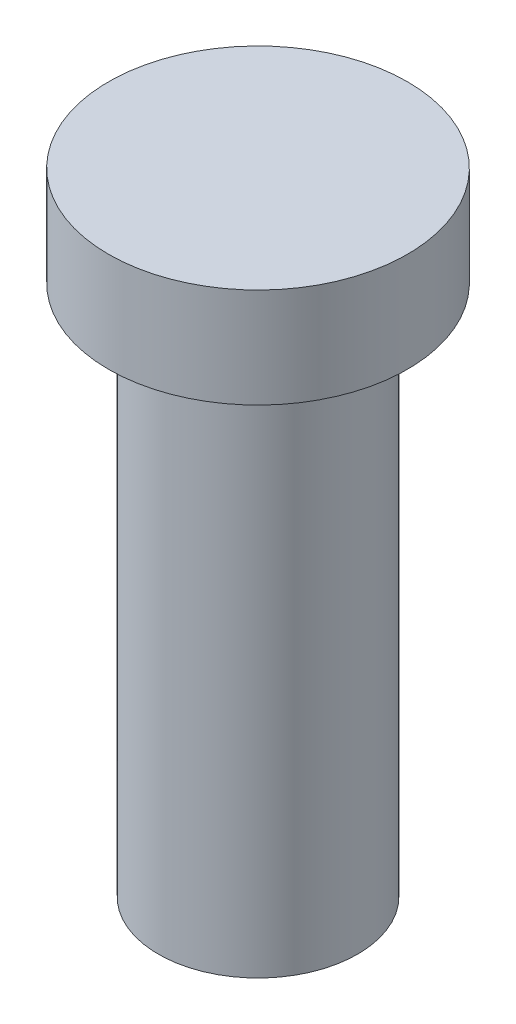
ISO-10303-21;
HEADER;
FILE_DESCRIPTION(('STEP AP214'),'2;1');
FILE_NAME('part.step','',(''),(''),'','','');
FILE_SCHEMA(('AUTOMOTIVE_DESIGN { 1 0 10303 214 1 1 1 1 }'));
ENDSEC;
DATA;
#1=APPLICATION_CONTEXT('core data for automotive mechanical design processes');
#2=APPLICATION_PROTOCOL_DEFINITION('international standard','automotive_design',2000,#1);
#3=PRODUCT_CONTEXT('',#1,'mechanical');
#4=PRODUCT('Part','Part','',(#3));
#5=PRODUCT_RELATED_PRODUCT_CATEGORY('part','',(#4));
#6=PRODUCT_DEFINITION_FORMATION('','',#4);
#7=PRODUCT_DEFINITION_CONTEXT('part definition',#1,'design');
#8=PRODUCT_DEFINITION('design','',#6,#7);
#9=PRODUCT_DEFINITION_SHAPE('','',#8);
#10=(LENGTH_UNIT() NAMED_UNIT(*) SI_UNIT(.MILLI.,.METRE.));
#11=(NAMED_UNIT(*) PLANE_ANGLE_UNIT() SI_UNIT($,.RADIAN.));
#12=(NAMED_UNIT(*) SI_UNIT($,.STERADIAN.) SOLID_ANGLE_UNIT());
#13=UNCERTAINTY_MEASURE_WITH_UNIT(LENGTH_MEASURE(1.E-05),#10,'distance_accuracy_value','');
#14=(GEOMETRIC_REPRESENTATION_CONTEXT(3) GLOBAL_UNCERTAINTY_ASSIGNED_CONTEXT((#13)) GLOBAL_UNIT_ASSIGNED_CONTEXT((#10,
#11,#12)) REPRESENTATION_CONTEXT('',''));
#15=CARTESIAN_POINT('',(0.,0.,0.));
#16=DIRECTION('',(0.,0.,1.));
#17=DIRECTION('',(1.,0.,0.));
#18=AXIS2_PLACEMENT_3D('',#15,#16,#17);
#19=CARTESIAN_POINT('',(0.,1.5,0.));
#20=DIRECTION('',(0.,-1.,0.));
#21=DIRECTION('',(0.,0.,-1.));
#22=AXIS2_PLACEMENT_3D('',#19,#20,#21);
#23=CYLINDRICAL_SURFACE('',#22,2.25);
#24=CARTESIAN_POINT('',(0.,1.5,0.));
#25=DIRECTION('',(0.,1.,0.));
#26=DIRECTION('',(0.,0.,1.));
#27=AXIS2_PLACEMENT_3D('',#24,#25,#26);
#28=CIRCLE('',#27,2.25);
#29=CARTESIAN_POINT('',(0.,1.5,2.25));
#30=VERTEX_POINT('',#29);
#31=EDGE_CURVE('E50',#30,#30,#28,.T.);
#32=ORIENTED_EDGE('',*,*,#31,.F.);
#33=EDGE_LOOP('',(#32));
#34=FACE_BOUND('',#33,.T.);
#35=CARTESIAN_POINT('',(0.,0.,0.));
#36=DIRECTION('',(0.,1.,0.));
#37=DIRECTION('',(0.,0.,1.));
#38=AXIS2_PLACEMENT_3D('',#35,#36,#37);
#39=CIRCLE('',#38,2.25);
#40=CARTESIAN_POINT('',(0.,0.,2.25));
#41=VERTEX_POINT('',#40);
#42=EDGE_CURVE('E46',#41,#41,#39,.T.);
#43=ORIENTED_EDGE('',*,*,#42,.T.);
#44=EDGE_LOOP('',(#43));
#45=FACE_BOUND('',#44,.T.);
#46=ADVANCED_FACE('F43',(#34,#45),#23,.T.);
#47=CARTESIAN_POINT('',(0.,1.5,0.));
#48=DIRECTION('',(0.,1.,0.));
#49=DIRECTION('',(0.,0.,1.));
#50=AXIS2_PLACEMENT_3D('',#47,#48,#49);
#51=PLANE('',#50);
#52=ORIENTED_EDGE('',*,*,#31,.T.);
#53=EDGE_LOOP('',(#52));
#54=FACE_BOUND('',#53,.T.);
#55=ADVANCED_FACE('F67',(#54),#51,.T.);
#56=CARTESIAN_POINT('',(0.,0.,0.));
#57=DIRECTION('',(0.,1.,0.));
#58=DIRECTION('',(0.,0.,1.));
#59=AXIS2_PLACEMENT_3D('',#56,#57,#58);
#60=PLANE('',#59);
#61=CARTESIAN_POINT('',(0.,0.,0.));
#62=DIRECTION('',(0.,-1.,0.));
#63=DIRECTION('',(0.,0.,-1.));
#64=AXIS2_PLACEMENT_3D('',#61,#62,#63);
#65=CIRCLE('',#64,1.5);
#66=CARTESIAN_POINT('',(0.,0.,-1.5));
#67=VERTEX_POINT('',#66);
#68=EDGE_CURVE('E10',#67,#67,#65,.T.);
#69=ORIENTED_EDGE('',*,*,#68,.F.);
#70=EDGE_LOOP('',(#69));
#71=FACE_BOUND('',#70,.T.);
#72=ORIENTED_EDGE('',*,*,#42,.F.);
#73=EDGE_LOOP('',(#72));
#74=FACE_BOUND('',#73,.T.);
#75=ADVANCED_FACE('F64',(#71,#74),#60,.F.);
#76=CARTESIAN_POINT('',(0.,-8.,0.));
#77=DIRECTION('',(0.,1.,0.));
#78=DIRECTION('',(0.,0.,1.));
#79=AXIS2_PLACEMENT_3D('',#76,#77,#78);
#80=CYLINDRICAL_SURFACE('',#79,1.5);
#81=CARTESIAN_POINT('',(0.,-8.,0.));
#82=DIRECTION('',(0.,-1.,0.));
#83=DIRECTION('',(0.,0.,-1.));
#84=AXIS2_PLACEMENT_3D('',#81,#82,#83);
#85=CIRCLE('',#84,1.5);
#86=CARTESIAN_POINT('',(0.,-8.,-1.5));
#87=VERTEX_POINT('',#86);
#88=EDGE_CURVE('E56',#87,#87,#85,.T.);
#89=ORIENTED_EDGE('',*,*,#88,.F.);
#90=EDGE_LOOP('',(#89));
#91=FACE_BOUND('',#90,.T.);
#92=ORIENTED_EDGE('',*,*,#68,.T.);
#93=EDGE_LOOP('',(#92));
#94=FACE_BOUND('',#93,.T.);
#95=ADVANCED_FACE('F66',(#91,#94),#80,.T.);
#96=CARTESIAN_POINT('',(0.,-8.,0.));
#97=DIRECTION('',(0.,-1.,0.));
#98=DIRECTION('',(0.,0.,-1.));
#99=AXIS2_PLACEMENT_3D('',#96,#97,#98);
#100=PLANE('',#99);
#101=ORIENTED_EDGE('',*,*,#88,.T.);
#102=EDGE_LOOP('',(#101));
#103=FACE_BOUND('',#102,.T.);
#104=ADVANCED_FACE('F73',(#103),#100,.T.);
#105=CLOSED_SHELL('',(#46,#55,#75,#95,#104));
#106=MANIFOLD_SOLID_BREP('B2',#105);
#107=ADVANCED_BREP_SHAPE_REPRESENTATION('',(#18,#106),#14);
#108=SHAPE_DEFINITION_REPRESENTATION(#9,#107);
ENDSEC;
END-ISO-10303-21;
